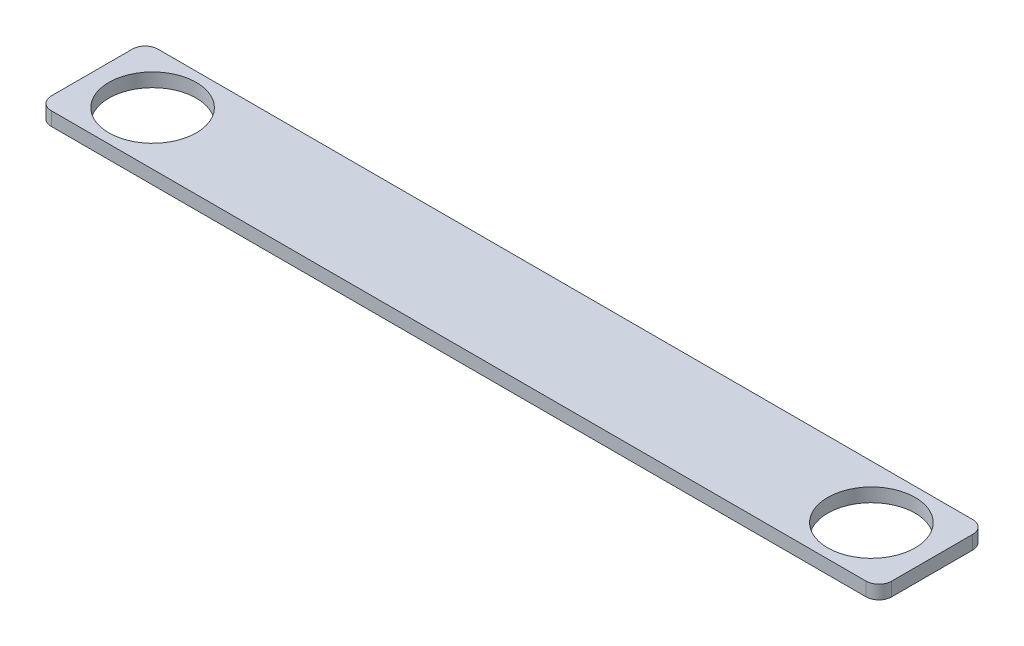
ISO-10303-21;
HEADER;
FILE_DESCRIPTION(('STEP AP214'),'2;1');
FILE_NAME('part.step','',(''),(''),'','','');
FILE_SCHEMA(('AUTOMOTIVE_DESIGN { 1 0 10303 214 1 1 1 1 }'));
ENDSEC;
DATA;
#1=APPLICATION_CONTEXT('core data for automotive mechanical design processes');
#2=APPLICATION_PROTOCOL_DEFINITION('international standard','automotive_design',2000,#1);
#3=PRODUCT_CONTEXT('',#1,'mechanical');
#4=PRODUCT('Part','Part','',(#3));
#5=PRODUCT_RELATED_PRODUCT_CATEGORY('part','',(#4));
#6=PRODUCT_DEFINITION_FORMATION('','',#4);
#7=PRODUCT_DEFINITION_CONTEXT('part definition',#1,'design');
#8=PRODUCT_DEFINITION('design','',#6,#7);
#9=PRODUCT_DEFINITION_SHAPE('','',#8);
#10=(LENGTH_UNIT() NAMED_UNIT(*) SI_UNIT(.MILLI.,.METRE.));
#11=(NAMED_UNIT(*) PLANE_ANGLE_UNIT() SI_UNIT($,.RADIAN.));
#12=(NAMED_UNIT(*) SI_UNIT($,.STERADIAN.) SOLID_ANGLE_UNIT());
#13=UNCERTAINTY_MEASURE_WITH_UNIT(LENGTH_MEASURE(1.E-05),#10,'distance_accuracy_value','');
#14=(GEOMETRIC_REPRESENTATION_CONTEXT(3) GLOBAL_UNCERTAINTY_ASSIGNED_CONTEXT((#13)) GLOBAL_UNIT_ASSIGNED_CONTEXT((#10,
#11,#12)) REPRESENTATION_CONTEXT('',''));
#15=CARTESIAN_POINT('',(0.,0.,0.));
#16=DIRECTION('',(0.,0.,1.));
#17=DIRECTION('',(1.,0.,0.));
#18=AXIS2_PLACEMENT_3D('',#15,#16,#17);
#19=CARTESIAN_POINT('',(-151.631999999975,3.2,12.5));
#20=DIRECTION('',(1.,0.,0.));
#21=DIRECTION('',(0.,0.,1.));
#22=AXIS2_PLACEMENT_3D('',#19,#20,#21);
#23=PLANE('',#22);
#24=DIRECTION('',(0.,0.,1.));
#25=VECTOR('',#24,1.);
#26=CARTESIAN_POINT('',(-151.631999999975,3.2,12.5));
#27=LINE('',#26,#25);
#28=CARTESIAN_POINT('',(-151.631999999975,3.2,-9.5));
#29=VERTEX_POINT('',#28);
#30=CARTESIAN_POINT('',(-151.631999999975,3.2,9.5));
#31=VERTEX_POINT('',#30);
#32=EDGE_CURVE('E146',#29,#31,#27,.T.);
#33=ORIENTED_EDGE('',*,*,#32,.F.);
#34=DIRECTION('',(0.,-1.,0.));
#35=VECTOR('',#34,1.);
#36=CARTESIAN_POINT('',(-151.631999999975,3.2,-9.5));
#37=LINE('',#36,#35);
#38=CARTESIAN_POINT('',(-151.631999999975,0.,-9.5));
#39=VERTEX_POINT('',#38);
#40=EDGE_CURVE('E11',#29,#39,#37,.T.);
#41=ORIENTED_EDGE('',*,*,#40,.T.);
#42=DIRECTION('',(0.,0.,-1.));
#43=VECTOR('',#42,1.);
#44=CARTESIAN_POINT('',(-151.631999999975,0.,0.));
#45=LINE('',#44,#43);
#46=CARTESIAN_POINT('',(-151.631999999975,0.,9.5));
#47=VERTEX_POINT('',#46);
#48=EDGE_CURVE('E147',#39,#47,#45,.F.);
#49=ORIENTED_EDGE('',*,*,#48,.T.);
#50=DIRECTION('',(0.,-1.,0.));
#51=VECTOR('',#50,1.);
#52=CARTESIAN_POINT('',(-151.631999999975,3.2,9.5));
#53=LINE('',#52,#51);
#54=EDGE_CURVE('E51',#47,#31,#53,.F.);
#55=ORIENTED_EDGE('',*,*,#54,.T.);
#56=EDGE_LOOP('',(#33,#41,#49,#55));
#57=FACE_BOUND('',#56,.T.);
#58=ADVANCED_FACE('F43',(#57),#23,.F.);
#59=CARTESIAN_POINT('',(-151.631999999975,3.2,12.5));
#60=DIRECTION('',(0.,0.,-1.));
#61=DIRECTION('',(1.,0.,0.));
#62=AXIS2_PLACEMENT_3D('',#59,#60,#61);
#63=PLANE('',#62);
#64=DIRECTION('',(1.,0.,0.));
#65=VECTOR('',#64,1.);
#66=CARTESIAN_POINT('',(0.,0.,12.5));
#67=LINE('',#66,#65);
#68=CARTESIAN_POINT('',(-148.631999999975,0.,12.5));
#69=VERTEX_POINT('',#68);
#70=CARTESIAN_POINT('',(42.3679999999969,0.,12.5));
#71=VERTEX_POINT('',#70);
#72=EDGE_CURVE('E169',#69,#71,#67,.T.);
#73=ORIENTED_EDGE('',*,*,#72,.T.);
#74=DIRECTION('',(0.,-1.,0.));
#75=VECTOR('',#74,1.);
#76=CARTESIAN_POINT('',(42.3679999999969,3.2,12.5));
#77=LINE('',#76,#75);
#78=CARTESIAN_POINT('',(42.3679999999969,3.2,12.5));
#79=VERTEX_POINT('',#78);
#80=EDGE_CURVE('E134',#71,#79,#77,.F.);
#81=ORIENTED_EDGE('',*,*,#80,.T.);
#82=DIRECTION('',(1.,0.,0.));
#83=VECTOR('',#82,1.);
#84=CARTESIAN_POINT('',(-151.631999999975,3.2,12.5));
#85=LINE('',#84,#83);
#86=CARTESIAN_POINT('',(-148.631999999975,3.2,12.5));
#87=VERTEX_POINT('',#86);
#88=EDGE_CURVE('E157',#87,#79,#85,.T.);
#89=ORIENTED_EDGE('',*,*,#88,.F.);
#90=DIRECTION('',(0.,-1.,0.));
#91=VECTOR('',#90,1.);
#92=CARTESIAN_POINT('',(-148.631999999975,3.2,12.5));
#93=LINE('',#92,#91);
#94=EDGE_CURVE('E137',#87,#69,#93,.T.);
#95=ORIENTED_EDGE('',*,*,#94,.T.);
#96=EDGE_LOOP('',(#73,#81,#89,#95));
#97=FACE_BOUND('',#96,.T.);
#98=ADVANCED_FACE('F200',(#97),#63,.F.);
#99=CARTESIAN_POINT('',(45.3679999999969,3.2,12.5));
#100=DIRECTION('',(-1.,0.,0.));
#101=DIRECTION('',(0.,0.,-1.));
#102=AXIS2_PLACEMENT_3D('',#99,#100,#101);
#103=PLANE('',#102);
#104=DIRECTION('',(0.,0.,-1.));
#105=VECTOR('',#104,1.);
#106=CARTESIAN_POINT('',(45.3679999999969,0.,0.));
#107=LINE('',#106,#105);
#108=CARTESIAN_POINT('',(45.3679999999969,0.,9.5));
#109=VERTEX_POINT('',#108);
#110=CARTESIAN_POINT('',(45.3679999999969,0.,-9.5));
#111=VERTEX_POINT('',#110);
#112=EDGE_CURVE('E113',#109,#111,#107,.T.);
#113=ORIENTED_EDGE('',*,*,#112,.T.);
#114=DIRECTION('',(0.,-1.,0.));
#115=VECTOR('',#114,1.);
#116=CARTESIAN_POINT('',(45.3679999999969,3.2,-9.5));
#117=LINE('',#116,#115);
#118=CARTESIAN_POINT('',(45.3679999999969,3.2,-9.5));
#119=VERTEX_POINT('',#118);
#120=EDGE_CURVE('E119',#111,#119,#117,.F.);
#121=ORIENTED_EDGE('',*,*,#120,.T.);
#122=DIRECTION('',(0.,0.,-1.));
#123=VECTOR('',#122,1.);
#124=CARTESIAN_POINT('',(45.3679999999969,3.2,12.5));
#125=LINE('',#124,#123);
#126=CARTESIAN_POINT('',(45.3679999999969,3.2,9.5));
#127=VERTEX_POINT('',#126);
#128=EDGE_CURVE('E116',#127,#119,#125,.T.);
#129=ORIENTED_EDGE('',*,*,#128,.F.);
#130=DIRECTION('',(0.,-1.,0.));
#131=VECTOR('',#130,1.);
#132=CARTESIAN_POINT('',(45.3679999999969,3.2,9.5));
#133=LINE('',#132,#131);
#134=EDGE_CURVE('E109',#127,#109,#133,.T.);
#135=ORIENTED_EDGE('',*,*,#134,.T.);
#136=EDGE_LOOP('',(#113,#121,#129,#135));
#137=FACE_BOUND('',#136,.T.);
#138=ADVANCED_FACE('F111',(#137),#103,.F.);
#139=CARTESIAN_POINT('',(-151.631999999975,3.2,-12.5));
#140=DIRECTION('',(0.,0.,1.));
#141=DIRECTION('',(-1.,0.,0.));
#142=AXIS2_PLACEMENT_3D('',#139,#140,#141);
#143=PLANE('',#142);
#144=DIRECTION('',(-1.,0.,0.));
#145=VECTOR('',#144,1.);
#146=CARTESIAN_POINT('',(-151.631999999975,3.2,-12.5));
#147=LINE('',#146,#145);
#148=CARTESIAN_POINT('',(42.3679999999969,3.2,-12.5));
#149=VERTEX_POINT('',#148);
#150=CARTESIAN_POINT('',(-148.631999999975,3.2,-12.5));
#151=VERTEX_POINT('',#150);
#152=EDGE_CURVE('E158',#149,#151,#147,.T.);
#153=ORIENTED_EDGE('',*,*,#152,.F.);
#154=DIRECTION('',(0.,-1.,0.));
#155=VECTOR('',#154,1.);
#156=CARTESIAN_POINT('',(42.3679999999969,3.2,-12.5));
#157=LINE('',#156,#155);
#158=CARTESIAN_POINT('',(42.3679999999969,0.,-12.5));
#159=VERTEX_POINT('',#158);
#160=EDGE_CURVE('E190',#149,#159,#157,.T.);
#161=ORIENTED_EDGE('',*,*,#160,.T.);
#162=DIRECTION('',(1.,0.,0.));
#163=VECTOR('',#162,1.);
#164=CARTESIAN_POINT('',(0.,0.,-12.5));
#165=LINE('',#164,#163);
#166=CARTESIAN_POINT('',(-148.631999999975,0.,-12.5));
#167=VERTEX_POINT('',#166);
#168=EDGE_CURVE('E129',#159,#167,#165,.F.);
#169=ORIENTED_EDGE('',*,*,#168,.T.);
#170=DIRECTION('',(0.,-1.,0.));
#171=VECTOR('',#170,1.);
#172=CARTESIAN_POINT('',(-148.631999999975,3.2,-12.5));
#173=LINE('',#172,#171);
#174=EDGE_CURVE('E187',#167,#151,#173,.F.);
#175=ORIENTED_EDGE('',*,*,#174,.T.);
#176=EDGE_LOOP('',(#153,#161,#169,#175));
#177=FACE_BOUND('',#176,.T.);
#178=ADVANCED_FACE('F194',(#177),#143,.F.);
#179=CARTESIAN_POINT('',(31.1179999999969,3.2,0.));
#180=DIRECTION('',(0.,-1.,0.));
#181=DIRECTION('',(0.,0.,-1.));
#182=AXIS2_PLACEMENT_3D('',#179,#180,#181);
#183=CYLINDRICAL_SURFACE('',#182,10.2500000000192);
#184=CARTESIAN_POINT('',(31.1179999999969,3.2,0.));
#185=DIRECTION('',(0.,1.,0.));
#186=DIRECTION('',(0.,0.,1.));
#187=AXIS2_PLACEMENT_3D('',#184,#185,#186);
#188=CIRCLE('',#187,10.2500000000192);
#189=CARTESIAN_POINT('',(31.1179999999969,3.2,10.2500000000192));
#190=VERTEX_POINT('',#189);
#191=EDGE_CURVE('E160',#190,#190,#188,.T.);
#192=ORIENTED_EDGE('',*,*,#191,.T.);
#193=EDGE_LOOP('',(#192));
#194=FACE_BOUND('',#193,.T.);
#195=CARTESIAN_POINT('',(31.1179999999969,0.,0.));
#196=DIRECTION('',(0.,1.,0.));
#197=DIRECTION('',(0.,0.,1.));
#198=AXIS2_PLACEMENT_3D('',#195,#196,#197);
#199=CIRCLE('',#198,10.2500000000192);
#200=CARTESIAN_POINT('',(31.1179999999969,0.,10.2500000000192));
#201=VERTEX_POINT('',#200);
#202=EDGE_CURVE('E171',#201,#201,#199,.T.);
#203=ORIENTED_EDGE('',*,*,#202,.F.);
#204=EDGE_LOOP('',(#203));
#205=FACE_BOUND('',#204,.T.);
#206=ADVANCED_FACE('F219',(#194,#205),#183,.F.);
#207=CARTESIAN_POINT('',(-137.381999999975,3.2,1.94289029309402E-11));
#208=DIRECTION('',(0.,-1.,0.));
#209=DIRECTION('',(0.,0.,-1.));
#210=AXIS2_PLACEMENT_3D('',#207,#208,#209);
#211=CYLINDRICAL_SURFACE('',#210,10.25);
#212=CARTESIAN_POINT('',(-137.381999999975,3.2,1.94289029309402E-11));
#213=DIRECTION('',(0.,1.,0.));
#214=DIRECTION('',(0.,0.,1.));
#215=AXIS2_PLACEMENT_3D('',#212,#213,#214);
#216=CIRCLE('',#215,10.25);
#217=CARTESIAN_POINT('',(-137.381999999975,3.2,10.2500000000194));
#218=VERTEX_POINT('',#217);
#219=EDGE_CURVE('E120',#218,#218,#216,.T.);
#220=ORIENTED_EDGE('',*,*,#219,.T.);
#221=EDGE_LOOP('',(#220));
#222=FACE_BOUND('',#221,.T.);
#223=CARTESIAN_POINT('',(-137.381999999975,0.,1.94289029309402E-11));
#224=DIRECTION('',(0.,1.,0.));
#225=DIRECTION('',(0.,0.,1.));
#226=AXIS2_PLACEMENT_3D('',#223,#224,#225);
#227=CIRCLE('',#226,10.25);
#228=CARTESIAN_POINT('',(-137.381999999975,0.,10.2500000000194));
#229=VERTEX_POINT('',#228);
#230=EDGE_CURVE('E177',#229,#229,#227,.T.);
#231=ORIENTED_EDGE('',*,*,#230,.F.);
#232=EDGE_LOOP('',(#231));
#233=FACE_BOUND('',#232,.T.);
#234=ADVANCED_FACE('F222',(#222,#233),#211,.F.);
#235=CARTESIAN_POINT('',(0.,3.2,0.));
#236=DIRECTION('',(0.,-1.,0.));
#237=DIRECTION('',(0.,0.,-1.));
#238=AXIS2_PLACEMENT_3D('',#235,#236,#237);
#239=PLANE('',#238);
#240=ORIENTED_EDGE('',*,*,#128,.T.);
#241=CARTESIAN_POINT('',(42.3679999999969,3.2,-9.5));
#242=DIRECTION('',(0.,-1.,0.));
#243=DIRECTION('',(0.,0.,-1.));
#244=AXIS2_PLACEMENT_3D('',#241,#242,#243);
#245=CIRCLE('',#244,3.);
#246=EDGE_CURVE('E185',#119,#149,#245,.F.);
#247=ORIENTED_EDGE('',*,*,#246,.T.);
#248=ORIENTED_EDGE('',*,*,#152,.T.);
#249=CARTESIAN_POINT('',(-148.631999999975,3.2,-9.5));
#250=DIRECTION('',(0.,-1.,0.));
#251=DIRECTION('',(0.,0.,-1.));
#252=AXIS2_PLACEMENT_3D('',#249,#250,#251);
#253=CIRCLE('',#252,3.);
#254=EDGE_CURVE('E156',#151,#29,#253,.F.);
#255=ORIENTED_EDGE('',*,*,#254,.T.);
#256=ORIENTED_EDGE('',*,*,#32,.T.);
#257=CARTESIAN_POINT('',(-148.631999999975,3.2,9.5));
#258=DIRECTION('',(0.,-1.,0.));
#259=DIRECTION('',(0.,0.,-1.));
#260=AXIS2_PLACEMENT_3D('',#257,#258,#259);
#261=CIRCLE('',#260,3.);
#262=EDGE_CURVE('E153',#31,#87,#261,.F.);
#263=ORIENTED_EDGE('',*,*,#262,.T.);
#264=ORIENTED_EDGE('',*,*,#88,.T.);
#265=CARTESIAN_POINT('',(42.3679999999969,3.2,9.5));
#266=DIRECTION('',(0.,-1.,0.));
#267=DIRECTION('',(0.,0.,-1.));
#268=AXIS2_PLACEMENT_3D('',#265,#266,#267);
#269=CIRCLE('',#268,3.);
#270=EDGE_CURVE('E183',#79,#127,#269,.F.);
#271=ORIENTED_EDGE('',*,*,#270,.T.);
#272=EDGE_LOOP('',(#240,#247,#248,#255,#256,#263,#264,#271));
#273=FACE_BOUND('',#272,.T.);
#274=ORIENTED_EDGE('',*,*,#191,.F.);
#275=EDGE_LOOP('',(#274));
#276=FACE_BOUND('',#275,.T.);
#277=ORIENTED_EDGE('',*,*,#219,.F.);
#278=EDGE_LOOP('',(#277));
#279=FACE_BOUND('',#278,.T.);
#280=ADVANCED_FACE('F150',(#273,#276,#279),#239,.F.);
#281=CARTESIAN_POINT('',(0.,0.,0.));
#282=DIRECTION('',(0.,-1.,0.));
#283=DIRECTION('',(0.,0.,-1.));
#284=AXIS2_PLACEMENT_3D('',#281,#282,#283);
#285=PLANE('',#284);
#286=ORIENTED_EDGE('',*,*,#168,.F.);
#287=CARTESIAN_POINT('',(42.3679999999969,0.,-9.5));
#288=DIRECTION('',(0.,-1.,0.));
#289=DIRECTION('',(0.,0.,-1.));
#290=AXIS2_PLACEMENT_3D('',#287,#288,#289);
#291=CIRCLE('',#290,3.);
#292=EDGE_CURVE('E128',#159,#111,#291,.T.);
#293=ORIENTED_EDGE('',*,*,#292,.T.);
#294=ORIENTED_EDGE('',*,*,#112,.F.);
#295=CARTESIAN_POINT('',(42.3679999999969,0.,9.5));
#296=DIRECTION('',(0.,-1.,0.));
#297=DIRECTION('',(0.,0.,-1.));
#298=AXIS2_PLACEMENT_3D('',#295,#296,#297);
#299=CIRCLE('',#298,3.);
#300=EDGE_CURVE('E125',#109,#71,#299,.T.);
#301=ORIENTED_EDGE('',*,*,#300,.T.);
#302=ORIENTED_EDGE('',*,*,#72,.F.);
#303=CARTESIAN_POINT('',(-148.631999999975,0.,9.5));
#304=DIRECTION('',(0.,-1.,0.));
#305=DIRECTION('',(0.,0.,-1.));
#306=AXIS2_PLACEMENT_3D('',#303,#304,#305);
#307=CIRCLE('',#306,3.);
#308=EDGE_CURVE('E58',#69,#47,#307,.T.);
#309=ORIENTED_EDGE('',*,*,#308,.T.);
#310=ORIENTED_EDGE('',*,*,#48,.F.);
#311=CARTESIAN_POINT('',(-148.631999999975,0.,-9.5));
#312=DIRECTION('',(0.,-1.,0.));
#313=DIRECTION('',(0.,0.,-1.));
#314=AXIS2_PLACEMENT_3D('',#311,#312,#313);
#315=CIRCLE('',#314,3.);
#316=EDGE_CURVE('E135',#39,#167,#315,.T.);
#317=ORIENTED_EDGE('',*,*,#316,.T.);
#318=EDGE_LOOP('',(#286,#293,#294,#301,#302,#309,#310,#317));
#319=FACE_BOUND('',#318,.T.);
#320=ORIENTED_EDGE('',*,*,#202,.T.);
#321=EDGE_LOOP('',(#320));
#322=FACE_BOUND('',#321,.T.);
#323=ORIENTED_EDGE('',*,*,#230,.T.);
#324=EDGE_LOOP('',(#323));
#325=FACE_BOUND('',#324,.T.);
#326=ADVANCED_FACE('F123',(#319,#322,#325),#285,.T.);
#327=CARTESIAN_POINT('',(42.3679999999969,3.2,-9.5));
#328=DIRECTION('',(0.,1.,0.));
#329=DIRECTION('',(0.,0.,1.));
#330=AXIS2_PLACEMENT_3D('',#327,#328,#329);
#331=CYLINDRICAL_SURFACE('',#330,3.);
#332=ORIENTED_EDGE('',*,*,#292,.F.);
#333=ORIENTED_EDGE('',*,*,#160,.F.);
#334=ORIENTED_EDGE('',*,*,#246,.F.);
#335=ORIENTED_EDGE('',*,*,#120,.F.);
#336=EDGE_LOOP('',(#332,#333,#334,#335));
#337=FACE_BOUND('',#336,.T.);
#338=ADVANCED_FACE('F198',(#337),#331,.T.);
#339=CARTESIAN_POINT('',(42.3679999999969,3.2,9.5));
#340=DIRECTION('',(0.,1.,0.));
#341=DIRECTION('',(0.,0.,1.));
#342=AXIS2_PLACEMENT_3D('',#339,#340,#341);
#343=CYLINDRICAL_SURFACE('',#342,3.);
#344=ORIENTED_EDGE('',*,*,#300,.F.);
#345=ORIENTED_EDGE('',*,*,#134,.F.);
#346=ORIENTED_EDGE('',*,*,#270,.F.);
#347=ORIENTED_EDGE('',*,*,#80,.F.);
#348=EDGE_LOOP('',(#344,#345,#346,#347));
#349=FACE_BOUND('',#348,.T.);
#350=ADVANCED_FACE('F132',(#349),#343,.T.);
#351=CARTESIAN_POINT('',(-148.631999999975,3.2,-9.5));
#352=DIRECTION('',(0.,1.,0.));
#353=DIRECTION('',(0.,0.,1.));
#354=AXIS2_PLACEMENT_3D('',#351,#352,#353);
#355=CYLINDRICAL_SURFACE('',#354,3.);
#356=ORIENTED_EDGE('',*,*,#316,.F.);
#357=ORIENTED_EDGE('',*,*,#40,.F.);
#358=ORIENTED_EDGE('',*,*,#254,.F.);
#359=ORIENTED_EDGE('',*,*,#174,.F.);
#360=EDGE_LOOP('',(#356,#357,#358,#359));
#361=FACE_BOUND('',#360,.T.);
#362=ADVANCED_FACE('F203',(#361),#355,.T.);
#363=CARTESIAN_POINT('',(-148.631999999975,3.2,9.5));
#364=DIRECTION('',(0.,1.,0.));
#365=DIRECTION('',(0.,0.,1.));
#366=AXIS2_PLACEMENT_3D('',#363,#364,#365);
#367=CYLINDRICAL_SURFACE('',#366,3.);
#368=ORIENTED_EDGE('',*,*,#308,.F.);
#369=ORIENTED_EDGE('',*,*,#94,.F.);
#370=ORIENTED_EDGE('',*,*,#262,.F.);
#371=ORIENTED_EDGE('',*,*,#54,.F.);
#372=EDGE_LOOP('',(#368,#369,#370,#371));
#373=FACE_BOUND('',#372,.T.);
#374=ADVANCED_FACE('F45',(#373),#367,.T.);
#375=CLOSED_SHELL('',(#58,#98,#138,#178,#206,#234,#280,#326,#338,#350,#362,#374));
#376=MANIFOLD_SOLID_BREP('B2',#375);
#377=ADVANCED_BREP_SHAPE_REPRESENTATION('',(#18,#376),#14);
#378=SHAPE_DEFINITION_REPRESENTATION(#9,#377);
ENDSEC;
END-ISO-10303-21;
